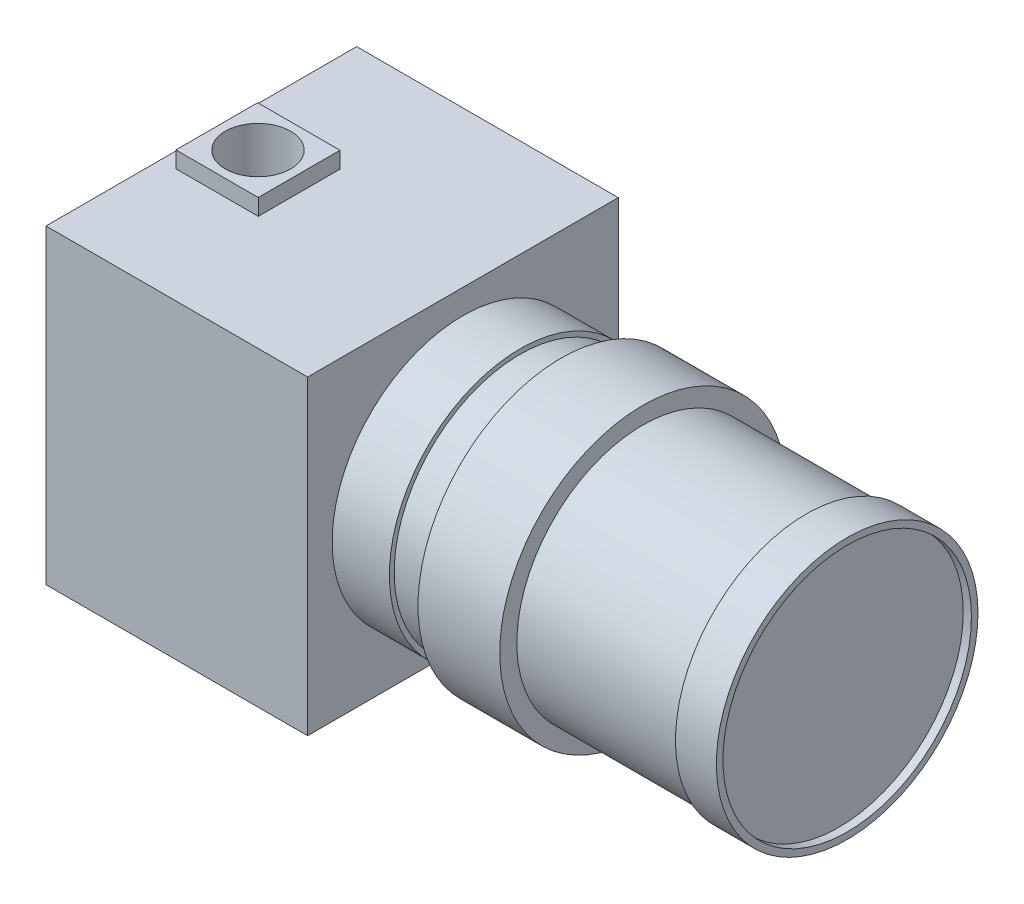
ISO-10303-21;
HEADER;
FILE_DESCRIPTION(('STEP AP214'),'2;1');
FILE_NAME('part.step','',(''),(''),'','','');
FILE_SCHEMA(('AUTOMOTIVE_DESIGN { 1 0 10303 214 1 1 1 1 }'));
ENDSEC;
DATA;
#1=APPLICATION_CONTEXT('core data for automotive mechanical design processes');
#2=APPLICATION_PROTOCOL_DEFINITION('international standard','automotive_design',2000,#1);
#3=PRODUCT_CONTEXT('',#1,'mechanical');
#4=PRODUCT('Part','Part','',(#3));
#5=PRODUCT_RELATED_PRODUCT_CATEGORY('part','',(#4));
#6=PRODUCT_DEFINITION_FORMATION('','',#4);
#7=PRODUCT_DEFINITION_CONTEXT('part definition',#1,'design');
#8=PRODUCT_DEFINITION('design','',#6,#7);
#9=PRODUCT_DEFINITION_SHAPE('','',#8);
#10=(LENGTH_UNIT() NAMED_UNIT(*) SI_UNIT(.MILLI.,.METRE.));
#11=(NAMED_UNIT(*) PLANE_ANGLE_UNIT() SI_UNIT($,.RADIAN.));
#12=(NAMED_UNIT(*) SI_UNIT($,.STERADIAN.) SOLID_ANGLE_UNIT());
#13=UNCERTAINTY_MEASURE_WITH_UNIT(LENGTH_MEASURE(1.E-05),#10,'distance_accuracy_value','');
#14=(GEOMETRIC_REPRESENTATION_CONTEXT(3) GLOBAL_UNCERTAINTY_ASSIGNED_CONTEXT((#13)) GLOBAL_UNIT_ASSIGNED_CONTEXT((#10,
#11,#12)) REPRESENTATION_CONTEXT('',''));
#15=CARTESIAN_POINT('',(0.,0.,0.));
#16=DIRECTION('',(0.,0.,1.));
#17=DIRECTION('',(1.,0.,0.));
#18=AXIS2_PLACEMENT_3D('',#15,#16,#17);
#19=CARTESIAN_POINT('',(79.,0.,0.));
#20=DIRECTION('',(-1.,0.,0.));
#21=DIRECTION('',(0.,0.,1.));
#22=AXIS2_PLACEMENT_3D('',#19,#20,#21);
#23=CYLINDRICAL_SURFACE('',#22,16.);
#24=CARTESIAN_POINT('',(32.,0.,0.));
#25=DIRECTION('',(1.,0.,0.));
#26=DIRECTION('',(0.,0.,-1.));
#27=AXIS2_PLACEMENT_3D('',#24,#25,#26);
#28=CIRCLE('',#27,16.);
#29=CARTESIAN_POINT('',(32.,0.,-16.));
#30=VERTEX_POINT('',#29);
#31=EDGE_CURVE('E11',#30,#30,#28,.T.);
#32=ORIENTED_EDGE('',*,*,#31,.T.);
#33=EDGE_LOOP('',(#32));
#34=FACE_BOUND('',#33,.T.);
#35=CARTESIAN_POINT('',(39.,0.,0.));
#36=DIRECTION('',(1.,0.,0.));
#37=DIRECTION('',(0.,0.,-1.));
#38=AXIS2_PLACEMENT_3D('',#35,#36,#37);
#39=CIRCLE('',#38,16.);
#40=CARTESIAN_POINT('',(39.,0.,-16.));
#41=VERTEX_POINT('',#40);
#42=EDGE_CURVE('E351',#41,#41,#39,.T.);
#43=ORIENTED_EDGE('',*,*,#42,.F.);
#44=EDGE_LOOP('',(#43));
#45=FACE_BOUND('',#44,.T.);
#46=ADVANCED_FACE('F39',(#34,#45),#23,.T.);
#47=CARTESIAN_POINT('',(32.,19.,-19.));
#48=DIRECTION('',(0.,0.,1.));
#49=DIRECTION('',(0.,-1.,0.));
#50=AXIS2_PLACEMENT_3D('',#47,#48,#49);
#51=PLANE('',#50);
#52=DIRECTION('',(0.,1.,0.));
#53=VECTOR('',#52,1.);
#54=CARTESIAN_POINT('',(0.,19.,-19.));
#55=LINE('',#54,#53);
#56=CARTESIAN_POINT('',(0.,-19.,-19.));
#57=VERTEX_POINT('',#56);
#58=CARTESIAN_POINT('',(0.,19.,-19.));
#59=VERTEX_POINT('',#58);
#60=EDGE_CURVE('E136',#57,#59,#55,.T.);
#61=ORIENTED_EDGE('',*,*,#60,.T.);
#62=DIRECTION('',(-1.,0.,0.));
#63=VECTOR('',#62,1.);
#64=CARTESIAN_POINT('',(32.,19.,-19.));
#65=LINE('',#64,#63);
#66=CARTESIAN_POINT('',(32.,19.,-19.));
#67=VERTEX_POINT('',#66);
#68=EDGE_CURVE('E43',#67,#59,#65,.T.);
#69=ORIENTED_EDGE('',*,*,#68,.F.);
#70=DIRECTION('',(0.,1.,0.));
#71=VECTOR('',#70,1.);
#72=CARTESIAN_POINT('',(32.,19.,-19.));
#73=LINE('',#72,#71);
#74=CARTESIAN_POINT('',(32.,-19.,-19.));
#75=VERTEX_POINT('',#74);
#76=EDGE_CURVE('E142',#75,#67,#73,.T.);
#77=ORIENTED_EDGE('',*,*,#76,.F.);
#78=DIRECTION('',(-1.,0.,0.));
#79=VECTOR('',#78,1.);
#80=CARTESIAN_POINT('',(32.,-19.,-19.));
#81=LINE('',#80,#79);
#82=EDGE_CURVE('E156',#75,#57,#81,.T.);
#83=ORIENTED_EDGE('',*,*,#82,.T.);
#84=EDGE_LOOP('',(#61,#69,#77,#83));
#85=FACE_BOUND('',#84,.T.);
#86=ADVANCED_FACE('F41',(#85),#51,.F.);
#87=CARTESIAN_POINT('',(32.,19.,19.));
#88=DIRECTION('',(0.,-1.,0.));
#89=DIRECTION('',(0.,0.,-1.));
#90=AXIS2_PLACEMENT_3D('',#87,#88,#89);
#91=PLANE('',#90);
#92=DIRECTION('',(0.,0.,-1.));
#93=VECTOR('',#92,1.);
#94=CARTESIAN_POINT('',(11.9619353710264,19.,-5.));
#95=LINE('',#94,#93);
#96=CARTESIAN_POINT('',(11.9619353710264,19.,5.));
#97=VERTEX_POINT('',#96);
#98=CARTESIAN_POINT('',(11.9619353710264,19.,-5.));
#99=VERTEX_POINT('',#98);
#100=EDGE_CURVE('E129',#97,#99,#95,.T.);
#101=ORIENTED_EDGE('',*,*,#100,.F.);
#102=DIRECTION('',(1.,0.,0.));
#103=VECTOR('',#102,1.);
#104=CARTESIAN_POINT('',(1.88786129695209,19.,5.));
#105=LINE('',#104,#103);
#106=CARTESIAN_POINT('',(1.88786129695209,19.,5.));
#107=VERTEX_POINT('',#106);
#108=EDGE_CURVE('E126',#107,#97,#105,.T.);
#109=ORIENTED_EDGE('',*,*,#108,.F.);
#110=DIRECTION('',(0.,0.,1.));
#111=VECTOR('',#110,1.);
#112=CARTESIAN_POINT('',(1.88786129695208,19.,-5.));
#113=LINE('',#112,#111);
#114=CARTESIAN_POINT('',(1.88786129695209,19.,-5.));
#115=VERTEX_POINT('',#114);
#116=EDGE_CURVE('E61',#115,#107,#113,.T.);
#117=ORIENTED_EDGE('',*,*,#116,.F.);
#118=DIRECTION('',(-1.,0.,0.));
#119=VECTOR('',#118,1.);
#120=CARTESIAN_POINT('',(1.88786129695208,19.,-5.));
#121=LINE('',#120,#119);
#122=EDGE_CURVE('E56',#99,#115,#121,.T.);
#123=ORIENTED_EDGE('',*,*,#122,.F.);
#124=EDGE_LOOP('',(#101,#109,#117,#123));
#125=FACE_BOUND('',#124,.T.);
#126=DIRECTION('',(0.,0.,1.));
#127=VECTOR('',#126,1.);
#128=CARTESIAN_POINT('',(0.,19.,19.));
#129=LINE('',#128,#127);
#130=CARTESIAN_POINT('',(0.,19.,19.));
#131=VERTEX_POINT('',#130);
#132=EDGE_CURVE('E160',#59,#131,#129,.T.);
#133=ORIENTED_EDGE('',*,*,#132,.T.);
#134=DIRECTION('',(-1.,0.,0.));
#135=VECTOR('',#134,1.);
#136=CARTESIAN_POINT('',(32.,19.,19.));
#137=LINE('',#136,#135);
#138=CARTESIAN_POINT('',(32.,19.,19.));
#139=VERTEX_POINT('',#138);
#140=EDGE_CURVE('E174',#139,#131,#137,.T.);
#141=ORIENTED_EDGE('',*,*,#140,.F.);
#142=DIRECTION('',(0.,0.,1.));
#143=VECTOR('',#142,1.);
#144=CARTESIAN_POINT('',(32.,19.,19.));
#145=LINE('',#144,#143);
#146=EDGE_CURVE('E146',#67,#139,#145,.T.);
#147=ORIENTED_EDGE('',*,*,#146,.F.);
#148=ORIENTED_EDGE('',*,*,#68,.T.);
#149=EDGE_LOOP('',(#133,#141,#147,#148));
#150=FACE_BOUND('',#149,.T.);
#151=ADVANCED_FACE('F185',(#125,#150),#91,.F.);
#152=CARTESIAN_POINT('',(32.,19.,19.));
#153=DIRECTION('',(0.,0.,-1.));
#154=DIRECTION('',(0.,1.,0.));
#155=AXIS2_PLACEMENT_3D('',#152,#153,#154);
#156=PLANE('',#155);
#157=DIRECTION('',(0.,-1.,0.));
#158=VECTOR('',#157,1.);
#159=CARTESIAN_POINT('',(0.,19.,19.));
#160=LINE('',#159,#158);
#161=CARTESIAN_POINT('',(0.,-19.,19.));
#162=VERTEX_POINT('',#161);
#163=EDGE_CURVE('E163',#131,#162,#160,.T.);
#164=ORIENTED_EDGE('',*,*,#163,.T.);
#165=DIRECTION('',(-1.,0.,0.));
#166=VECTOR('',#165,1.);
#167=CARTESIAN_POINT('',(32.,-19.,19.));
#168=LINE('',#167,#166);
#169=CARTESIAN_POINT('',(32.,-19.,19.));
#170=VERTEX_POINT('',#169);
#171=EDGE_CURVE('E171',#170,#162,#168,.T.);
#172=ORIENTED_EDGE('',*,*,#171,.F.);
#173=DIRECTION('',(0.,-1.,0.));
#174=VECTOR('',#173,1.);
#175=CARTESIAN_POINT('',(32.,19.,19.));
#176=LINE('',#175,#174);
#177=EDGE_CURVE('E150',#139,#170,#176,.T.);
#178=ORIENTED_EDGE('',*,*,#177,.F.);
#179=ORIENTED_EDGE('',*,*,#140,.T.);
#180=EDGE_LOOP('',(#164,#172,#178,#179));
#181=FACE_BOUND('',#180,.T.);
#182=ADVANCED_FACE('F194',(#181),#156,.F.);
#183=CARTESIAN_POINT('',(32.,-19.,19.));
#184=DIRECTION('',(0.,1.,0.));
#185=DIRECTION('',(0.,0.,1.));
#186=AXIS2_PLACEMENT_3D('',#183,#184,#185);
#187=PLANE('',#186);
#188=DIRECTION('',(0.,0.,-1.));
#189=VECTOR('',#188,1.);
#190=CARTESIAN_POINT('',(0.,-19.,19.));
#191=LINE('',#190,#189);
#192=EDGE_CURVE('E147',#162,#57,#191,.T.);
#193=ORIENTED_EDGE('',*,*,#192,.T.);
#194=ORIENTED_EDGE('',*,*,#82,.F.);
#195=DIRECTION('',(0.,0.,-1.));
#196=VECTOR('',#195,1.);
#197=CARTESIAN_POINT('',(32.,-19.,19.));
#198=LINE('',#197,#196);
#199=EDGE_CURVE('E153',#170,#75,#198,.T.);
#200=ORIENTED_EDGE('',*,*,#199,.F.);
#201=ORIENTED_EDGE('',*,*,#171,.T.);
#202=EDGE_LOOP('',(#193,#194,#200,#201));
#203=FACE_BOUND('',#202,.T.);
#204=ADVANCED_FACE('F197',(#203),#187,.F.);
#205=CARTESIAN_POINT('',(32.,0.,0.));
#206=DIRECTION('',(1.,0.,0.));
#207=DIRECTION('',(0.,0.,-1.));
#208=AXIS2_PLACEMENT_3D('',#205,#206,#207);
#209=PLANE('',#208);
#210=ORIENTED_EDGE('',*,*,#31,.F.);
#211=EDGE_LOOP('',(#210));
#212=FACE_BOUND('',#211,.T.);
#213=ORIENTED_EDGE('',*,*,#76,.T.);
#214=ORIENTED_EDGE('',*,*,#146,.T.);
#215=ORIENTED_EDGE('',*,*,#177,.T.);
#216=ORIENTED_EDGE('',*,*,#199,.T.);
#217=EDGE_LOOP('',(#213,#214,#215,#216));
#218=FACE_BOUND('',#217,.T.);
#219=ADVANCED_FACE('F199',(#212,#218),#209,.T.);
#220=CARTESIAN_POINT('',(0.,0.,0.));
#221=DIRECTION('',(1.,0.,0.));
#222=DIRECTION('',(0.,0.,-1.));
#223=AXIS2_PLACEMENT_3D('',#220,#221,#222);
#224=PLANE('',#223);
#225=ORIENTED_EDGE('',*,*,#60,.F.);
#226=ORIENTED_EDGE('',*,*,#192,.F.);
#227=ORIENTED_EDGE('',*,*,#163,.F.);
#228=ORIENTED_EDGE('',*,*,#132,.F.);
#229=EDGE_LOOP('',(#225,#226,#227,#228));
#230=FACE_BOUND('',#229,.T.);
#231=ADVANCED_FACE('F192',(#230),#224,.F.);
#232=CARTESIAN_POINT('',(0.,21.,0.));
#233=DIRECTION('',(0.,1.,0.));
#234=DIRECTION('',(0.,0.,1.));
#235=AXIS2_PLACEMENT_3D('',#232,#233,#234);
#236=PLANE('',#235);
#237=DIRECTION('',(0.,0.,-1.));
#238=VECTOR('',#237,1.);
#239=CARTESIAN_POINT('',(11.9619353710264,21.,-5.));
#240=LINE('',#239,#238);
#241=CARTESIAN_POINT('',(11.9619353710264,21.,5.));
#242=VERTEX_POINT('',#241);
#243=CARTESIAN_POINT('',(11.9619353710264,21.,-5.));
#244=VERTEX_POINT('',#243);
#245=EDGE_CURVE('E115',#242,#244,#240,.T.);
#246=ORIENTED_EDGE('',*,*,#245,.T.);
#247=DIRECTION('',(-1.,0.,0.));
#248=VECTOR('',#247,1.);
#249=CARTESIAN_POINT('',(1.88786129695208,21.,-5.));
#250=LINE('',#249,#248);
#251=CARTESIAN_POINT('',(1.88786129695208,21.,-5.));
#252=VERTEX_POINT('',#251);
#253=EDGE_CURVE('E103',#244,#252,#250,.T.);
#254=ORIENTED_EDGE('',*,*,#253,.T.);
#255=DIRECTION('',(0.,0.,1.));
#256=VECTOR('',#255,1.);
#257=CARTESIAN_POINT('',(1.88786129695208,21.,-5.));
#258=LINE('',#257,#256);
#259=CARTESIAN_POINT('',(1.88786129695209,21.,5.));
#260=VERTEX_POINT('',#259);
#261=EDGE_CURVE('E114',#252,#260,#258,.T.);
#262=ORIENTED_EDGE('',*,*,#261,.T.);
#263=DIRECTION('',(1.,0.,0.));
#264=VECTOR('',#263,1.);
#265=CARTESIAN_POINT('',(1.88786129695209,21.,5.));
#266=LINE('',#265,#264);
#267=EDGE_CURVE('E121',#260,#242,#266,.T.);
#268=ORIENTED_EDGE('',*,*,#267,.T.);
#269=EDGE_LOOP('',(#246,#254,#262,#268));
#270=FACE_BOUND('',#269,.T.);
#271=CARTESIAN_POINT('',(6.92489833398924,21.,0.));
#272=DIRECTION('',(0.,1.,0.));
#273=DIRECTION('',(0.,0.,1.));
#274=AXIS2_PLACEMENT_3D('',#271,#272,#273);
#275=CIRCLE('',#274,4.);
#276=CARTESIAN_POINT('',(6.92489833398924,21.,4.));
#277=VERTEX_POINT('',#276);
#278=EDGE_CURVE('E246',#277,#277,#275,.T.);
#279=ORIENTED_EDGE('',*,*,#278,.F.);
#280=EDGE_LOOP('',(#279));
#281=FACE_BOUND('',#280,.T.);
#282=ADVANCED_FACE('F118',(#270,#281),#236,.T.);
#283=CARTESIAN_POINT('',(11.9619353710264,21.,-5.));
#284=DIRECTION('',(-1.,0.,0.));
#285=DIRECTION('',(0.,0.,1.));
#286=AXIS2_PLACEMENT_3D('',#283,#284,#285);
#287=PLANE('',#286);
#288=ORIENTED_EDGE('',*,*,#100,.T.);
#289=DIRECTION('',(0.,-1.,0.));
#290=VECTOR('',#289,1.);
#291=CARTESIAN_POINT('',(11.9619353710264,21.,-5.));
#292=LINE('',#291,#290);
#293=EDGE_CURVE('E107',#244,#99,#292,.T.);
#294=ORIENTED_EDGE('',*,*,#293,.F.);
#295=ORIENTED_EDGE('',*,*,#245,.F.);
#296=DIRECTION('',(0.,-1.,0.));
#297=VECTOR('',#296,1.);
#298=CARTESIAN_POINT('',(11.9619353710264,21.,5.));
#299=LINE('',#298,#297);
#300=EDGE_CURVE('E260',#242,#97,#299,.T.);
#301=ORIENTED_EDGE('',*,*,#300,.T.);
#302=EDGE_LOOP('',(#288,#294,#295,#301));
#303=FACE_BOUND('',#302,.T.);
#304=ADVANCED_FACE('F128',(#303),#287,.F.);
#305=CARTESIAN_POINT('',(1.88786129695208,21.,-5.));
#306=DIRECTION('',(0.,0.,1.));
#307=DIRECTION('',(1.,0.,0.));
#308=AXIS2_PLACEMENT_3D('',#305,#306,#307);
#309=PLANE('',#308);
#310=ORIENTED_EDGE('',*,*,#122,.T.);
#311=DIRECTION('',(0.,-1.,0.));
#312=VECTOR('',#311,1.);
#313=CARTESIAN_POINT('',(1.88786129695208,21.,-5.));
#314=LINE('',#313,#312);
#315=EDGE_CURVE('E110',#252,#115,#314,.T.);
#316=ORIENTED_EDGE('',*,*,#315,.F.);
#317=ORIENTED_EDGE('',*,*,#253,.F.);
#318=ORIENTED_EDGE('',*,*,#293,.T.);
#319=EDGE_LOOP('',(#310,#316,#317,#318));
#320=FACE_BOUND('',#319,.T.);
#321=ADVANCED_FACE('F105',(#320),#309,.F.);
#322=CARTESIAN_POINT('',(1.88786129695208,21.,-5.));
#323=DIRECTION('',(1.,0.,0.));
#324=DIRECTION('',(0.,0.,-1.));
#325=AXIS2_PLACEMENT_3D('',#322,#323,#324);
#326=PLANE('',#325);
#327=ORIENTED_EDGE('',*,*,#116,.T.);
#328=DIRECTION('',(0.,-1.,0.));
#329=VECTOR('',#328,1.);
#330=CARTESIAN_POINT('',(1.88786129695209,21.,5.));
#331=LINE('',#330,#329);
#332=EDGE_CURVE('E138',#260,#107,#331,.T.);
#333=ORIENTED_EDGE('',*,*,#332,.F.);
#334=ORIENTED_EDGE('',*,*,#261,.F.);
#335=ORIENTED_EDGE('',*,*,#315,.T.);
#336=EDGE_LOOP('',(#327,#333,#334,#335));
#337=FACE_BOUND('',#336,.T.);
#338=ADVANCED_FACE('F277',(#337),#326,.F.);
#339=CARTESIAN_POINT('',(1.88786129695209,21.,5.));
#340=DIRECTION('',(0.,0.,-1.));
#341=DIRECTION('',(-1.,0.,0.));
#342=AXIS2_PLACEMENT_3D('',#339,#340,#341);
#343=PLANE('',#342);
#344=ORIENTED_EDGE('',*,*,#108,.T.);
#345=ORIENTED_EDGE('',*,*,#300,.F.);
#346=ORIENTED_EDGE('',*,*,#267,.F.);
#347=ORIENTED_EDGE('',*,*,#332,.T.);
#348=EDGE_LOOP('',(#344,#345,#346,#347));
#349=FACE_BOUND('',#348,.T.);
#350=ADVANCED_FACE('F275',(#349),#343,.F.);
#351=CARTESIAN_POINT('',(6.92489833398924,21.,0.));
#352=DIRECTION('',(0.,-1.,0.));
#353=DIRECTION('',(0.,0.,-1.));
#354=AXIS2_PLACEMENT_3D('',#351,#352,#353);
#355=CYLINDRICAL_SURFACE('',#354,4.);
#356=ORIENTED_EDGE('',*,*,#278,.T.);
#357=EDGE_LOOP('',(#356));
#358=FACE_BOUND('',#357,.T.);
#359=CARTESIAN_POINT('',(6.92489833398924,14.,0.));
#360=DIRECTION('',(0.,1.,0.));
#361=DIRECTION('',(0.,0.,1.));
#362=AXIS2_PLACEMENT_3D('',#359,#360,#361);
#363=CIRCLE('',#362,4.);
#364=CARTESIAN_POINT('',(6.92489833398924,14.,4.));
#365=VERTEX_POINT('',#364);
#366=EDGE_CURVE('E240',#365,#365,#363,.T.);
#367=ORIENTED_EDGE('',*,*,#366,.F.);
#368=EDGE_LOOP('',(#367));
#369=FACE_BOUND('',#368,.T.);
#370=ADVANCED_FACE('F284',(#358,#369),#355,.F.);
#371=CARTESIAN_POINT('',(0.,14.,0.));
#372=DIRECTION('',(0.,1.,0.));
#373=DIRECTION('',(0.,0.,1.));
#374=AXIS2_PLACEMENT_3D('',#371,#372,#373);
#375=PLANE('',#374);
#376=ORIENTED_EDGE('',*,*,#366,.T.);
#377=EDGE_LOOP('',(#376));
#378=FACE_BOUND('',#377,.T.);
#379=ADVANCED_FACE('F298',(#378),#375,.T.);
#380=CARTESIAN_POINT('',(39.,0.,0.));
#381=DIRECTION('',(1.,0.,0.));
#382=DIRECTION('',(0.,0.,-1.));
#383=AXIS2_PLACEMENT_3D('',#380,#381,#382);
#384=PLANE('',#383);
#385=CARTESIAN_POINT('',(39.,0.,0.));
#386=DIRECTION('',(1.,0.,0.));
#387=DIRECTION('',(0.,0.,-1.));
#388=AXIS2_PLACEMENT_3D('',#385,#386,#387);
#389=CIRCLE('',#388,15.4128751453122);
#390=CARTESIAN_POINT('',(39.,0.,-15.4128751453122));
#391=VERTEX_POINT('',#390);
#392=EDGE_CURVE('E344',#391,#391,#389,.T.);
#393=ORIENTED_EDGE('',*,*,#392,.F.);
#394=EDGE_LOOP('',(#393));
#395=FACE_BOUND('',#394,.T.);
#396=ORIENTED_EDGE('',*,*,#42,.T.);
#397=EDGE_LOOP('',(#396));
#398=FACE_BOUND('',#397,.T.);
#399=ADVANCED_FACE('F301',(#395,#398),#384,.T.);
#400=CARTESIAN_POINT('',(39.,0.,0.));
#401=DIRECTION('',(1.,0.,0.));
#402=DIRECTION('',(0.,0.,-1.));
#403=AXIS2_PLACEMENT_3D('',#400,#401,#402);
#404=CYLINDRICAL_SURFACE('',#403,15.4128751453122);
#405=ORIENTED_EDGE('',*,*,#392,.T.);
#406=EDGE_LOOP('',(#405));
#407=FACE_BOUND('',#406,.T.);
#408=CARTESIAN_POINT('',(44.,0.,0.));
#409=DIRECTION('',(1.,0.,0.));
#410=DIRECTION('',(0.,0.,-1.));
#411=AXIS2_PLACEMENT_3D('',#408,#409,#410);
#412=CIRCLE('',#411,15.4128751453122);
#413=CARTESIAN_POINT('',(44.,0.,-15.4128751453122));
#414=VERTEX_POINT('',#413);
#415=EDGE_CURVE('E338',#414,#414,#412,.T.);
#416=ORIENTED_EDGE('',*,*,#415,.F.);
#417=EDGE_LOOP('',(#416));
#418=FACE_BOUND('',#417,.T.);
#419=ADVANCED_FACE('F230',(#407,#418),#404,.T.);
#420=CARTESIAN_POINT('',(79.,0.,0.));
#421=DIRECTION('',(1.,0.,0.));
#422=DIRECTION('',(0.,0.,-1.));
#423=AXIS2_PLACEMENT_3D('',#420,#421,#422);
#424=PLANE('',#423);
#425=CARTESIAN_POINT('',(79.,0.,0.));
#426=DIRECTION('',(1.,0.,0.));
#427=DIRECTION('',(0.,0.,-1.));
#428=AXIS2_PLACEMENT_3D('',#425,#426,#427);
#429=CIRCLE('',#428,15.1976784885537);
#430=CARTESIAN_POINT('',(79.,0.,-15.1976784885537));
#431=VERTEX_POINT('',#430);
#432=EDGE_CURVE('E339',#431,#431,#429,.T.);
#433=ORIENTED_EDGE('',*,*,#432,.F.);
#434=EDGE_LOOP('',(#433));
#435=FACE_BOUND('',#434,.T.);
#436=CARTESIAN_POINT('',(79.,0.,0.));
#437=DIRECTION('',(1.,0.,0.));
#438=DIRECTION('',(0.,0.,-1.));
#439=AXIS2_PLACEMENT_3D('',#436,#437,#438);
#440=CIRCLE('',#439,16.);
#441=CARTESIAN_POINT('',(79.,0.,-16.));
#442=VERTEX_POINT('',#441);
#443=EDGE_CURVE('E131',#442,#442,#440,.T.);
#444=ORIENTED_EDGE('',*,*,#443,.T.);
#445=EDGE_LOOP('',(#444));
#446=FACE_BOUND('',#445,.T.);
#447=ADVANCED_FACE('F221',(#435,#446),#424,.T.);
#448=CARTESIAN_POINT('',(74.,0.,0.));
#449=DIRECTION('',(1.,0.,0.));
#450=DIRECTION('',(0.,0.,-1.));
#451=AXIS2_PLACEMENT_3D('',#448,#449,#450);
#452=CIRCLE('',#451,16.);
#453=CARTESIAN_POINT('',(74.,0.,-16.));
#454=VERTEX_POINT('',#453);
#455=EDGE_CURVE('E235',#454,#454,#452,.T.);
#456=ORIENTED_EDGE('',*,*,#455,.T.);
#457=EDGE_LOOP('',(#456));
#458=FACE_BOUND('',#457,.T.);
#459=ORIENTED_EDGE('',*,*,#443,.F.);
#460=EDGE_LOOP('',(#459));
#461=FACE_BOUND('',#460,.T.);
#462=ADVANCED_FACE('F213',(#458,#461),#23,.T.);
#463=CARTESIAN_POINT('',(74.,0.,0.));
#464=DIRECTION('',(1.,0.,0.));
#465=DIRECTION('',(0.,0.,-1.));
#466=AXIS2_PLACEMENT_3D('',#463,#464,#465);
#467=PLANE('',#466);
#468=CARTESIAN_POINT('',(74.,0.,0.));
#469=DIRECTION('',(1.,0.,0.));
#470=DIRECTION('',(0.,0.,-1.));
#471=AXIS2_PLACEMENT_3D('',#468,#469,#470);
#472=CIRCLE('',#471,15.4128751453122);
#473=CARTESIAN_POINT('',(74.,0.,-15.4128751453122));
#474=VERTEX_POINT('',#473);
#475=EDGE_CURVE('E249',#474,#474,#472,.T.);
#476=ORIENTED_EDGE('',*,*,#475,.T.);
#477=EDGE_LOOP('',(#476));
#478=FACE_BOUND('',#477,.T.);
#479=ORIENTED_EDGE('',*,*,#455,.F.);
#480=EDGE_LOOP('',(#479));
#481=FACE_BOUND('',#480,.T.);
#482=ADVANCED_FACE('F220',(#478,#481),#467,.F.);
#483=CARTESIAN_POINT('',(54.,0.,0.));
#484=DIRECTION('',(1.,0.,0.));
#485=DIRECTION('',(0.,0.,-1.));
#486=AXIS2_PLACEMENT_3D('',#483,#484,#485);
#487=CYLINDRICAL_SURFACE('',#486,15.4128751453122);
#488=CARTESIAN_POINT('',(54.,0.,0.));
#489=DIRECTION('',(1.,0.,0.));
#490=DIRECTION('',(0.,0.,-1.));
#491=AXIS2_PLACEMENT_3D('',#488,#489,#490);
#492=CIRCLE('',#491,15.4128751453122);
#493=CARTESIAN_POINT('',(54.,0.,-15.4128751453122));
#494=VERTEX_POINT('',#493);
#495=EDGE_CURVE('E241',#494,#494,#492,.T.);
#496=ORIENTED_EDGE('',*,*,#495,.T.);
#497=EDGE_LOOP('',(#496));
#498=FACE_BOUND('',#497,.T.);
#499=ORIENTED_EDGE('',*,*,#475,.F.);
#500=EDGE_LOOP('',(#499));
#501=FACE_BOUND('',#500,.T.);
#502=ADVANCED_FACE('F227',(#498,#501),#487,.T.);
#503=CARTESIAN_POINT('',(54.,0.,0.));
#504=DIRECTION('',(1.,0.,0.));
#505=DIRECTION('',(0.,0.,-1.));
#506=AXIS2_PLACEMENT_3D('',#503,#504,#505);
#507=PLANE('',#506);
#508=ORIENTED_EDGE('',*,*,#495,.F.);
#509=EDGE_LOOP('',(#508));
#510=FACE_BOUND('',#509,.T.);
#511=CARTESIAN_POINT('',(54.,0.,0.));
#512=DIRECTION('',(1.,0.,0.));
#513=DIRECTION('',(0.,0.,-1.));
#514=AXIS2_PLACEMENT_3D('',#511,#512,#513);
#515=CIRCLE('',#514,17.5);
#516=CARTESIAN_POINT('',(54.,0.,-17.5));
#517=VERTEX_POINT('',#516);
#518=EDGE_CURVE('E356',#517,#517,#515,.T.);
#519=ORIENTED_EDGE('',*,*,#518,.T.);
#520=EDGE_LOOP('',(#519));
#521=FACE_BOUND('',#520,.T.);
#522=ADVANCED_FACE('F304',(#510,#521),#507,.T.);
#523=CARTESIAN_POINT('',(44.,0.,0.));
#524=DIRECTION('',(1.,0.,0.));
#525=DIRECTION('',(0.,0.,-1.));
#526=AXIS2_PLACEMENT_3D('',#523,#524,#525);
#527=CYLINDRICAL_SURFACE('',#526,17.5);
#528=CARTESIAN_POINT('',(44.,0.,0.));
#529=DIRECTION('',(1.,0.,0.));
#530=DIRECTION('',(0.,0.,-1.));
#531=AXIS2_PLACEMENT_3D('',#528,#529,#530);
#532=CIRCLE('',#531,17.5);
#533=CARTESIAN_POINT('',(44.,0.,-17.5));
#534=VERTEX_POINT('',#533);
#535=EDGE_CURVE('E357',#534,#534,#532,.T.);
#536=ORIENTED_EDGE('',*,*,#535,.T.);
#537=EDGE_LOOP('',(#536));
#538=FACE_BOUND('',#537,.T.);
#539=ORIENTED_EDGE('',*,*,#518,.F.);
#540=EDGE_LOOP('',(#539));
#541=FACE_BOUND('',#540,.T.);
#542=ADVANCED_FACE('F307',(#538,#541),#527,.T.);
#543=CARTESIAN_POINT('',(44.,0.,0.));
#544=DIRECTION('',(1.,0.,0.));
#545=DIRECTION('',(0.,0.,-1.));
#546=AXIS2_PLACEMENT_3D('',#543,#544,#545);
#547=PLANE('',#546);
#548=ORIENTED_EDGE('',*,*,#535,.F.);
#549=EDGE_LOOP('',(#548));
#550=FACE_BOUND('',#549,.T.);
#551=ORIENTED_EDGE('',*,*,#415,.T.);
#552=EDGE_LOOP('',(#551));
#553=FACE_BOUND('',#552,.T.);
#554=ADVANCED_FACE('F314',(#550,#553),#547,.F.);
#555=CARTESIAN_POINT('',(78.,0.,0.));
#556=DIRECTION('',(1.,0.,0.));
#557=DIRECTION('',(0.,0.,-1.));
#558=AXIS2_PLACEMENT_3D('',#555,#556,#557);
#559=CYLINDRICAL_SURFACE('',#558,15.1976784885537);
#560=CARTESIAN_POINT('',(78.,0.,0.));
#561=DIRECTION('',(1.,0.,0.));
#562=DIRECTION('',(0.,0.,-1.));
#563=AXIS2_PLACEMENT_3D('',#560,#561,#562);
#564=CIRCLE('',#563,15.1976784885537);
#565=CARTESIAN_POINT('',(78.,0.,-15.1976784885537));
#566=VERTEX_POINT('',#565);
#567=EDGE_CURVE('E336',#566,#566,#564,.T.);
#568=ORIENTED_EDGE('',*,*,#567,.F.);
#569=EDGE_LOOP('',(#568));
#570=FACE_BOUND('',#569,.T.);
#571=ORIENTED_EDGE('',*,*,#432,.T.);
#572=EDGE_LOOP('',(#571));
#573=FACE_BOUND('',#572,.T.);
#574=ADVANCED_FACE('F318',(#570,#573),#559,.F.);
#575=CARTESIAN_POINT('',(78.,0.,0.));
#576=DIRECTION('',(1.,0.,0.));
#577=DIRECTION('',(0.,0.,-1.));
#578=AXIS2_PLACEMENT_3D('',#575,#576,#577);
#579=PLANE('',#578);
#580=ORIENTED_EDGE('',*,*,#567,.T.);
#581=EDGE_LOOP('',(#580));
#582=FACE_BOUND('',#581,.T.);
#583=ADVANCED_FACE('F328',(#582),#579,.T.);
#584=CLOSED_SHELL('',(#46,#86,#151,#182,#204,#219,#231,#282,#304,#321,#338,#350,#370,#379,#399,
#419,#447,#462,#482,#502,#522,#542,#554,#574,#583));
#585=MANIFOLD_SOLID_BREP('B2',#584);
#586=ADVANCED_BREP_SHAPE_REPRESENTATION('',(#18,#585),#14);
#587=SHAPE_DEFINITION_REPRESENTATION(#9,#586);
ENDSEC;
END-ISO-10303-21;
